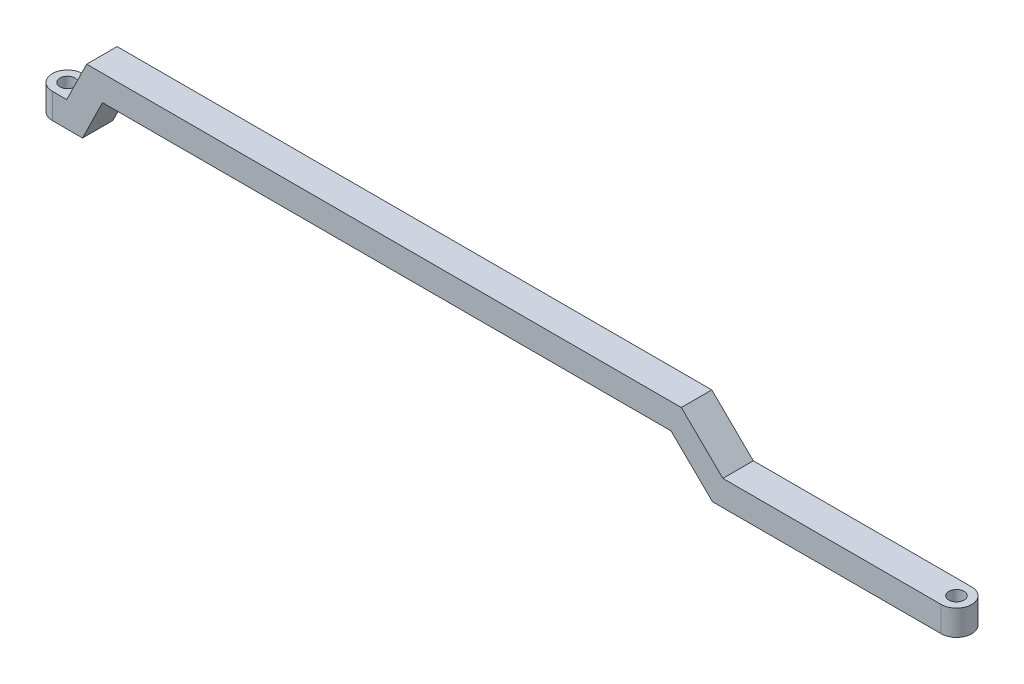
ISO-10303-21;
HEADER;
FILE_DESCRIPTION(('STEP AP214'),'2;1');
FILE_NAME('part.step','',(''),(''),'','','');
FILE_SCHEMA(('AUTOMOTIVE_DESIGN { 1 0 10303 214 1 1 1 1 }'));
ENDSEC;
DATA;
#1=APPLICATION_CONTEXT('core data for automotive mechanical design processes');
#2=APPLICATION_PROTOCOL_DEFINITION('international standard','automotive_design',2000,#1);
#3=PRODUCT_CONTEXT('',#1,'mechanical');
#4=PRODUCT('Part','Part','',(#3));
#5=PRODUCT_RELATED_PRODUCT_CATEGORY('part','',(#4));
#6=PRODUCT_DEFINITION_FORMATION('','',#4);
#7=PRODUCT_DEFINITION_CONTEXT('part definition',#1,'design');
#8=PRODUCT_DEFINITION('design','',#6,#7);
#9=PRODUCT_DEFINITION_SHAPE('','',#8);
#10=(LENGTH_UNIT() NAMED_UNIT(*) SI_UNIT(.MILLI.,.METRE.));
#11=(NAMED_UNIT(*) PLANE_ANGLE_UNIT() SI_UNIT($,.RADIAN.));
#12=(NAMED_UNIT(*) SI_UNIT($,.STERADIAN.) SOLID_ANGLE_UNIT());
#13=UNCERTAINTY_MEASURE_WITH_UNIT(LENGTH_MEASURE(1.E-05),#10,'distance_accuracy_value','');
#14=(GEOMETRIC_REPRESENTATION_CONTEXT(3) GLOBAL_UNCERTAINTY_ASSIGNED_CONTEXT((#13)) GLOBAL_UNIT_ASSIGNED_CONTEXT((#10,
#11,#12)) REPRESENTATION_CONTEXT('',''));
#15=CARTESIAN_POINT('',(0.,0.,0.));
#16=DIRECTION('',(0.,0.,1.));
#17=DIRECTION('',(1.,0.,0.));
#18=AXIS2_PLACEMENT_3D('',#15,#16,#17);
#19=CARTESIAN_POINT('',(175.,0.,0.));
#20=DIRECTION('',(0.,1.,0.));
#21=DIRECTION('',(0.,0.,1.));
#22=AXIS2_PLACEMENT_3D('',#19,#20,#21);
#23=PLANE('',#22);
#24=CARTESIAN_POINT('',(0.,0.,0.));
#25=DIRECTION('',(0.,1.,0.));
#26=DIRECTION('',(0.,0.,1.));
#27=AXIS2_PLACEMENT_3D('',#24,#25,#26);
#28=CIRCLE('',#27,1.5);
#29=CARTESIAN_POINT('',(0.,0.,1.5));
#30=VERTEX_POINT('',#29);
#31=EDGE_CURVE('E179',#30,#30,#28,.T.);
#32=ORIENTED_EDGE('',*,*,#31,.T.);
#33=EDGE_LOOP('',(#32));
#34=FACE_BOUND('',#33,.T.);
#35=DIRECTION('',(-1.,0.,0.));
#36=VECTOR('',#35,1.);
#37=CARTESIAN_POINT('',(175.,0.,-2.99999999999999));
#38=LINE('',#37,#36);
#39=CARTESIAN_POINT('',(5.95704390429327,0.,-3.));
#40=VERTEX_POINT('',#39);
#41=CARTESIAN_POINT('',(0.,0.,-3.));
#42=VERTEX_POINT('',#41);
#43=EDGE_CURVE('E205',#40,#42,#38,.T.);
#44=ORIENTED_EDGE('',*,*,#43,.F.);
#45=DIRECTION('',(0.,0.,1.));
#46=VECTOR('',#45,1.);
#47=CARTESIAN_POINT('',(5.95704390429327,0.,0.));
#48=LINE('',#47,#46);
#49=CARTESIAN_POINT('',(5.95704390429328,0.,3.));
#50=VERTEX_POINT('',#49);
#51=EDGE_CURVE('E149',#40,#50,#48,.T.);
#52=ORIENTED_EDGE('',*,*,#51,.T.);
#53=DIRECTION('',(1.,0.,0.));
#54=VECTOR('',#53,1.);
#55=CARTESIAN_POINT('',(0.,0.,3.));
#56=LINE('',#55,#54);
#57=CARTESIAN_POINT('',(0.,0.,3.));
#58=VERTEX_POINT('',#57);
#59=EDGE_CURVE('E192',#58,#50,#56,.T.);
#60=ORIENTED_EDGE('',*,*,#59,.F.);
#61=CARTESIAN_POINT('',(0.,0.,0.));
#62=DIRECTION('',(0.,1.,0.));
#63=DIRECTION('',(0.,0.,1.));
#64=AXIS2_PLACEMENT_3D('',#61,#62,#63);
#65=CIRCLE('',#64,3.);
#66=EDGE_CURVE('E207',#42,#58,#65,.T.);
#67=ORIENTED_EDGE('',*,*,#66,.F.);
#68=EDGE_LOOP('',(#44,#52,#60,#67));
#69=FACE_BOUND('',#68,.T.);
#70=ADVANCED_FACE('F34',(#34,#69),#23,.F.);
#71=CARTESIAN_POINT('',(175.,5.,0.));
#72=DIRECTION('',(0.,1.,0.));
#73=DIRECTION('',(0.,0.,1.));
#74=AXIS2_PLACEMENT_3D('',#71,#72,#73);
#75=PLANE('',#74);
#76=CARTESIAN_POINT('',(0.,5.,0.));
#77=DIRECTION('',(0.,1.,0.));
#78=DIRECTION('',(0.,0.,1.));
#79=AXIS2_PLACEMENT_3D('',#76,#77,#78);
#80=CIRCLE('',#79,1.5);
#81=CARTESIAN_POINT('',(0.,5.,1.5));
#82=VERTEX_POINT('',#81);
#83=EDGE_CURVE('E182',#82,#82,#80,.T.);
#84=ORIENTED_EDGE('',*,*,#83,.F.);
#85=EDGE_LOOP('',(#84));
#86=FACE_BOUND('',#85,.T.);
#87=DIRECTION('',(1.,0.,0.));
#88=VECTOR('',#87,1.);
#89=CARTESIAN_POINT('',(0.,5.,3.));
#90=LINE('',#89,#88);
#91=CARTESIAN_POINT('',(0.,5.,3.));
#92=VERTEX_POINT('',#91);
#93=CARTESIAN_POINT('',(2.84064601719081,5.,3.));
#94=VERTEX_POINT('',#93);
#95=EDGE_CURVE('E199',#92,#94,#90,.T.);
#96=ORIENTED_EDGE('',*,*,#95,.T.);
#97=DIRECTION('',(0.,0.,-1.));
#98=VECTOR('',#97,1.);
#99=CARTESIAN_POINT('',(2.84064601719081,5.,3.));
#100=LINE('',#99,#98);
#101=CARTESIAN_POINT('',(2.84064601719081,5.,-3.));
#102=VERTEX_POINT('',#101);
#103=EDGE_CURVE('E161',#94,#102,#100,.T.);
#104=ORIENTED_EDGE('',*,*,#103,.T.);
#105=DIRECTION('',(-1.,0.,0.));
#106=VECTOR('',#105,1.);
#107=CARTESIAN_POINT('',(175.,5.,-2.99999999999999));
#108=LINE('',#107,#106);
#109=CARTESIAN_POINT('',(0.,5.,-3.));
#110=VERTEX_POINT('',#109);
#111=EDGE_CURVE('E191',#102,#110,#108,.T.);
#112=ORIENTED_EDGE('',*,*,#111,.T.);
#113=CARTESIAN_POINT('',(0.,5.,0.));
#114=DIRECTION('',(0.,1.,0.));
#115=DIRECTION('',(0.,0.,1.));
#116=AXIS2_PLACEMENT_3D('',#113,#114,#115);
#117=CIRCLE('',#116,3.);
#118=EDGE_CURVE('E196',#110,#92,#117,.T.);
#119=ORIENTED_EDGE('',*,*,#118,.T.);
#120=EDGE_LOOP('',(#96,#104,#112,#119));
#121=FACE_BOUND('',#120,.T.);
#122=ADVANCED_FACE('F240',(#86,#121),#75,.T.);
#123=DIRECTION('',(0.,0.,-1.));
#124=VECTOR('',#123,1.);
#125=CARTESIAN_POINT('',(132.006982503277,5.,3.));
#126=LINE('',#125,#124);
#127=CARTESIAN_POINT('',(132.006982503277,5.,3.));
#128=VERTEX_POINT('',#127);
#129=CARTESIAN_POINT('',(132.006982503277,5.,-3.));
#130=VERTEX_POINT('',#129);
#131=EDGE_CURVE('E168',#128,#130,#126,.T.);
#132=ORIENTED_EDGE('',*,*,#131,.F.);
#133=CARTESIAN_POINT('',(175.,5.,2.99999999999999));
#134=VERTEX_POINT('',#133);
#135=EDGE_CURVE('E198',#128,#134,#90,.T.);
#136=ORIENTED_EDGE('',*,*,#135,.T.);
#137=CARTESIAN_POINT('',(175.,5.,0.));
#138=DIRECTION('',(0.,1.,0.));
#139=DIRECTION('',(0.,0.,1.));
#140=AXIS2_PLACEMENT_3D('',#137,#138,#139);
#141=CIRCLE('',#140,2.99999999999999);
#142=CARTESIAN_POINT('',(175.,5.,-2.99999999999999));
#143=VERTEX_POINT('',#142);
#144=EDGE_CURVE('E188',#134,#143,#141,.T.);
#145=ORIENTED_EDGE('',*,*,#144,.T.);
#146=EDGE_CURVE('E193',#143,#130,#108,.T.);
#147=ORIENTED_EDGE('',*,*,#146,.T.);
#148=EDGE_LOOP('',(#132,#136,#145,#147));
#149=FACE_BOUND('',#148,.T.);
#150=CARTESIAN_POINT('',(175.,5.,0.));
#151=DIRECTION('',(0.,1.,0.));
#152=DIRECTION('',(0.,0.,1.));
#153=AXIS2_PLACEMENT_3D('',#150,#151,#152);
#154=CIRCLE('',#153,1.5);
#155=CARTESIAN_POINT('',(175.,5.,1.5));
#156=VERTEX_POINT('',#155);
#157=EDGE_CURVE('E176',#156,#156,#154,.T.);
#158=ORIENTED_EDGE('',*,*,#157,.F.);
#159=EDGE_LOOP('',(#158));
#160=FACE_BOUND('',#159,.T.);
#161=ADVANCED_FACE('F251',(#149,#160),#75,.T.);
#162=CARTESIAN_POINT('',(129.967789522726,0.,3.));
#163=VERTEX_POINT('',#162);
#164=CARTESIAN_POINT('',(175.,0.,2.99999999999999));
#165=VERTEX_POINT('',#164);
#166=EDGE_CURVE('E209',#163,#165,#56,.T.);
#167=ORIENTED_EDGE('',*,*,#166,.F.);
#168=DIRECTION('',(0.,0.,-1.));
#169=VECTOR('',#168,1.);
#170=CARTESIAN_POINT('',(129.967789522726,0.,0.));
#171=LINE('',#170,#169);
#172=CARTESIAN_POINT('',(129.967789522726,0.,-3.));
#173=VERTEX_POINT('',#172);
#174=EDGE_CURVE('E49',#163,#173,#171,.T.);
#175=ORIENTED_EDGE('',*,*,#174,.T.);
#176=CARTESIAN_POINT('',(175.,0.,-2.99999999999999));
#177=VERTEX_POINT('',#176);
#178=EDGE_CURVE('E143',#177,#173,#38,.T.);
#179=ORIENTED_EDGE('',*,*,#178,.F.);
#180=CARTESIAN_POINT('',(175.,0.,0.));
#181=DIRECTION('',(0.,1.,0.));
#182=DIRECTION('',(0.,0.,1.));
#183=AXIS2_PLACEMENT_3D('',#180,#181,#182);
#184=CIRCLE('',#183,2.99999999999999);
#185=EDGE_CURVE('E185',#165,#177,#184,.T.);
#186=ORIENTED_EDGE('',*,*,#185,.F.);
#187=EDGE_LOOP('',(#167,#175,#179,#186));
#188=FACE_BOUND('',#187,.T.);
#189=CARTESIAN_POINT('',(175.,0.,0.));
#190=DIRECTION('',(0.,1.,0.));
#191=DIRECTION('',(0.,0.,1.));
#192=AXIS2_PLACEMENT_3D('',#189,#190,#191);
#193=CIRCLE('',#192,1.5);
#194=CARTESIAN_POINT('',(175.,0.,1.5));
#195=VERTEX_POINT('',#194);
#196=EDGE_CURVE('E170',#195,#195,#193,.T.);
#197=ORIENTED_EDGE('',*,*,#196,.T.);
#198=EDGE_LOOP('',(#197));
#199=FACE_BOUND('',#198,.T.);
#200=ADVANCED_FACE('F259',(#188,#199),#23,.F.);
#201=CARTESIAN_POINT('',(175.,5.,0.));
#202=DIRECTION('',(0.,-1.,0.));
#203=DIRECTION('',(0.,0.,-1.));
#204=AXIS2_PLACEMENT_3D('',#201,#202,#203);
#205=CYLINDRICAL_SURFACE('',#204,2.99999999999999);
#206=ORIENTED_EDGE('',*,*,#185,.T.);
#207=DIRECTION('',(0.,-1.,0.));
#208=VECTOR('',#207,1.);
#209=CARTESIAN_POINT('',(175.,5.,-2.99999999999999));
#210=LINE('',#209,#208);
#211=EDGE_CURVE('E220',#143,#177,#210,.T.);
#212=ORIENTED_EDGE('',*,*,#211,.F.);
#213=ORIENTED_EDGE('',*,*,#144,.F.);
#214=DIRECTION('',(0.,-1.,0.));
#215=VECTOR('',#214,1.);
#216=CARTESIAN_POINT('',(175.,5.,2.99999999999999));
#217=LINE('',#216,#215);
#218=EDGE_CURVE('E202',#134,#165,#217,.T.);
#219=ORIENTED_EDGE('',*,*,#218,.T.);
#220=EDGE_LOOP('',(#206,#212,#213,#219));
#221=FACE_BOUND('',#220,.T.);
#222=ADVANCED_FACE('F36',(#221),#205,.T.);
#223=CARTESIAN_POINT('',(175.,5.,-2.99999999999999));
#224=DIRECTION('',(0.,0.,1.));
#225=DIRECTION('',(1.,0.,0.));
#226=AXIS2_PLACEMENT_3D('',#223,#224,#225);
#227=PLANE('',#226);
#228=DIRECTION('',(1.,0.,0.));
#229=VECTOR('',#228,1.);
#230=CARTESIAN_POINT('',(9.88159134992837,8.,-3.));
#231=LINE('',#230,#229);
#232=CARTESIAN_POINT('',(9.88159134992837,8.,-3.));
#233=VERTEX_POINT('',#232);
#234=CARTESIAN_POINT('',(121.791342394145,7.99999999999999,-3.));
#235=VERTEX_POINT('',#234);
#236=EDGE_CURVE('E133',#233,#235,#231,.T.);
#237=ORIENTED_EDGE('',*,*,#236,.F.);
#238=DIRECTION('',(0.440426725303606,0.897788560652419,0.));
#239=VECTOR('',#238,1.);
#240=CARTESIAN_POINT('',(9.88159134992837,8.,-3.));
#241=LINE('',#240,#239);
#242=EDGE_CURVE('E130',#40,#233,#241,.T.);
#243=ORIENTED_EDGE('',*,*,#242,.F.);
#244=ORIENTED_EDGE('',*,*,#43,.T.);
#245=DIRECTION('',(0.,-1.,0.));
#246=VECTOR('',#245,1.);
#247=CARTESIAN_POINT('',(0.,5.,-3.));
#248=LINE('',#247,#246);
#249=EDGE_CURVE('E217',#110,#42,#248,.T.);
#250=ORIENTED_EDGE('',*,*,#249,.F.);
#251=ORIENTED_EDGE('',*,*,#111,.F.);
#252=DIRECTION('',(0.440426725303606,0.897788560652419,0.));
#253=VECTOR('',#252,1.);
#254=CARTESIAN_POINT('',(6.76519346282589,13.,-3.));
#255=LINE('',#254,#253);
#256=CARTESIAN_POINT('',(6.76519346282589,13.,-3.));
#257=VERTEX_POINT('',#256);
#258=EDGE_CURVE('E57',#102,#257,#255,.T.);
#259=ORIENTED_EDGE('',*,*,#258,.T.);
#260=DIRECTION('',(1.,0.,0.));
#261=VECTOR('',#260,1.);
#262=CARTESIAN_POINT('',(123.830535374697,13.,-3.));
#263=LINE('',#262,#261);
#264=CARTESIAN_POINT('',(123.830535374697,13.,-3.));
#265=VERTEX_POINT('',#264);
#266=EDGE_CURVE('E163',#257,#265,#263,.T.);
#267=ORIENTED_EDGE('',*,*,#266,.T.);
#268=DIRECTION('',(0.714777139316145,-0.699352301140869,0.));
#269=VECTOR('',#268,1.);
#270=CARTESIAN_POINT('',(132.006982503277,5.,-3.));
#271=LINE('',#270,#269);
#272=EDGE_CURVE('E156',#265,#130,#271,.T.);
#273=ORIENTED_EDGE('',*,*,#272,.T.);
#274=ORIENTED_EDGE('',*,*,#146,.F.);
#275=ORIENTED_EDGE('',*,*,#211,.T.);
#276=ORIENTED_EDGE('',*,*,#178,.T.);
#277=DIRECTION('',(0.714777139316145,-0.699352301140869,0.));
#278=VECTOR('',#277,1.);
#279=CARTESIAN_POINT('',(121.791342394145,7.99999999999999,-3.));
#280=LINE('',#279,#278);
#281=EDGE_CURVE('E125',#235,#173,#280,.T.);
#282=ORIENTED_EDGE('',*,*,#281,.F.);
#283=EDGE_LOOP('',(#237,#243,#244,#250,#251,#259,#267,#273,#274,#275,#276,#282));
#284=FACE_BOUND('',#283,.T.);
#285=ADVANCED_FACE('F141',(#284),#227,.F.);
#286=CARTESIAN_POINT('',(0.,5.,0.));
#287=DIRECTION('',(0.,-1.,0.));
#288=DIRECTION('',(0.,0.,-1.));
#289=AXIS2_PLACEMENT_3D('',#286,#287,#288);
#290=CYLINDRICAL_SURFACE('',#289,3.);
#291=ORIENTED_EDGE('',*,*,#66,.T.);
#292=DIRECTION('',(0.,-1.,0.));
#293=VECTOR('',#292,1.);
#294=CARTESIAN_POINT('',(0.,5.,3.));
#295=LINE('',#294,#293);
#296=EDGE_CURVE('E214',#92,#58,#295,.T.);
#297=ORIENTED_EDGE('',*,*,#296,.F.);
#298=ORIENTED_EDGE('',*,*,#118,.F.);
#299=ORIENTED_EDGE('',*,*,#249,.T.);
#300=EDGE_LOOP('',(#291,#297,#298,#299));
#301=FACE_BOUND('',#300,.T.);
#302=ADVANCED_FACE('F234',(#301),#290,.T.);
#303=CARTESIAN_POINT('',(0.,5.,3.));
#304=DIRECTION('',(0.,0.,-1.));
#305=DIRECTION('',(-1.,0.,0.));
#306=AXIS2_PLACEMENT_3D('',#303,#304,#305);
#307=PLANE('',#306);
#308=ORIENTED_EDGE('',*,*,#59,.T.);
#309=DIRECTION('',(0.440426725303606,0.897788560652419,0.));
#310=VECTOR('',#309,1.);
#311=CARTESIAN_POINT('',(6.77857251978876,1.67464631655135,3.));
#312=LINE('',#311,#310);
#313=CARTESIAN_POINT('',(9.88159134992837,8.,3.));
#314=VERTEX_POINT('',#313);
#315=EDGE_CURVE('E11',#50,#314,#312,.T.);
#316=ORIENTED_EDGE('',*,*,#315,.T.);
#317=DIRECTION('',(1.,0.,0.));
#318=VECTOR('',#317,1.);
#319=CARTESIAN_POINT('',(0.,8.,3.));
#320=LINE('',#319,#318);
#321=CARTESIAN_POINT('',(121.791342394145,7.99999999999999,3.));
#322=VERTEX_POINT('',#321);
#323=EDGE_CURVE('E42',#314,#322,#320,.T.);
#324=ORIENTED_EDGE('',*,*,#323,.T.);
#325=DIRECTION('',(0.714777139316145,-0.699352301140869,0.));
#326=VECTOR('',#325,1.);
#327=CARTESIAN_POINT('',(61.0670142189035,67.4139016326394,3.));
#328=LINE('',#327,#326);
#329=EDGE_CURVE('E126',#322,#163,#328,.T.);
#330=ORIENTED_EDGE('',*,*,#329,.T.);
#331=ORIENTED_EDGE('',*,*,#166,.T.);
#332=ORIENTED_EDGE('',*,*,#218,.F.);
#333=ORIENTED_EDGE('',*,*,#135,.F.);
#334=DIRECTION('',(0.714777139316145,-0.699352301140869,0.));
#335=VECTOR('',#334,1.);
#336=CARTESIAN_POINT('',(132.006982503277,5.,3.));
#337=LINE('',#336,#335);
#338=CARTESIAN_POINT('',(123.830535374697,13.,3.));
#339=VERTEX_POINT('',#338);
#340=EDGE_CURVE('E159',#339,#128,#337,.T.);
#341=ORIENTED_EDGE('',*,*,#340,.F.);
#342=DIRECTION('',(1.,0.,0.));
#343=VECTOR('',#342,1.);
#344=CARTESIAN_POINT('',(123.830535374697,13.,3.));
#345=LINE('',#344,#343);
#346=CARTESIAN_POINT('',(6.76519346282589,13.,3.));
#347=VERTEX_POINT('',#346);
#348=EDGE_CURVE('E155',#347,#339,#345,.T.);
#349=ORIENTED_EDGE('',*,*,#348,.F.);
#350=DIRECTION('',(0.440426725303606,0.897788560652419,0.));
#351=VECTOR('',#350,1.);
#352=CARTESIAN_POINT('',(6.76519346282589,13.,3.));
#353=LINE('',#352,#351);
#354=EDGE_CURVE('E152',#94,#347,#353,.T.);
#355=ORIENTED_EDGE('',*,*,#354,.F.);
#356=ORIENTED_EDGE('',*,*,#95,.F.);
#357=ORIENTED_EDGE('',*,*,#296,.T.);
#358=EDGE_LOOP('',(#308,#316,#324,#330,#331,#332,#333,#341,#349,#355,#356,#357));
#359=FACE_BOUND('',#358,.T.);
#360=ADVANCED_FACE('F223',(#359),#307,.F.);
#361=CARTESIAN_POINT('',(0.,5.,0.));
#362=DIRECTION('',(0.,-1.,0.));
#363=DIRECTION('',(0.,0.,-1.));
#364=AXIS2_PLACEMENT_3D('',#361,#362,#363);
#365=CYLINDRICAL_SURFACE('',#364,1.5);
#366=ORIENTED_EDGE('',*,*,#83,.T.);
#367=EDGE_LOOP('',(#366));
#368=FACE_BOUND('',#367,.T.);
#369=ORIENTED_EDGE('',*,*,#31,.F.);
#370=EDGE_LOOP('',(#369));
#371=FACE_BOUND('',#370,.T.);
#372=ADVANCED_FACE('F267',(#368,#371),#365,.F.);
#373=CARTESIAN_POINT('',(175.,5.,0.));
#374=DIRECTION('',(0.,-1.,0.));
#375=DIRECTION('',(0.,0.,-1.));
#376=AXIS2_PLACEMENT_3D('',#373,#374,#375);
#377=CYLINDRICAL_SURFACE('',#376,1.5);
#378=ORIENTED_EDGE('',*,*,#157,.T.);
#379=EDGE_LOOP('',(#378));
#380=FACE_BOUND('',#379,.T.);
#381=ORIENTED_EDGE('',*,*,#196,.F.);
#382=EDGE_LOOP('',(#381));
#383=FACE_BOUND('',#382,.T.);
#384=ADVANCED_FACE('F265',(#380,#383),#377,.F.);
#385=CARTESIAN_POINT('',(132.006982503277,5.,3.));
#386=DIRECTION('',(0.699352301140869,0.714777139316145,0.));
#387=DIRECTION('',(-0.714777139316145,0.699352301140869,0.));
#388=AXIS2_PLACEMENT_3D('',#385,#386,#387);
#389=PLANE('',#388);
#390=ORIENTED_EDGE('',*,*,#272,.F.);
#391=DIRECTION('',(0.,0.,-1.));
#392=VECTOR('',#391,1.);
#393=CARTESIAN_POINT('',(123.830535374697,13.,3.));
#394=LINE('',#393,#392);
#395=EDGE_CURVE('E171',#339,#265,#394,.T.);
#396=ORIENTED_EDGE('',*,*,#395,.F.);
#397=ORIENTED_EDGE('',*,*,#340,.T.);
#398=ORIENTED_EDGE('',*,*,#131,.T.);
#399=EDGE_LOOP('',(#390,#396,#397,#398));
#400=FACE_BOUND('',#399,.T.);
#401=ADVANCED_FACE('F246',(#400),#389,.T.);
#402=CARTESIAN_POINT('',(123.830535374697,13.,3.));
#403=DIRECTION('',(0.,1.,0.));
#404=DIRECTION('',(0.,0.,1.));
#405=AXIS2_PLACEMENT_3D('',#402,#403,#404);
#406=PLANE('',#405);
#407=ORIENTED_EDGE('',*,*,#266,.F.);
#408=DIRECTION('',(0.,0.,-1.));
#409=VECTOR('',#408,1.);
#410=CARTESIAN_POINT('',(6.76519346282589,13.,3.));
#411=LINE('',#410,#409);
#412=EDGE_CURVE('E173',#347,#257,#411,.T.);
#413=ORIENTED_EDGE('',*,*,#412,.F.);
#414=ORIENTED_EDGE('',*,*,#348,.T.);
#415=ORIENTED_EDGE('',*,*,#395,.T.);
#416=EDGE_LOOP('',(#407,#413,#414,#415));
#417=FACE_BOUND('',#416,.T.);
#418=ADVANCED_FACE('F274',(#417),#406,.T.);
#419=CARTESIAN_POINT('',(6.76519346282589,13.,3.));
#420=DIRECTION('',(-0.897788560652419,0.440426725303606,0.));
#421=DIRECTION('',(-0.440426725303606,-0.897788560652419,0.));
#422=AXIS2_PLACEMENT_3D('',#419,#420,#421);
#423=PLANE('',#422);
#424=ORIENTED_EDGE('',*,*,#258,.F.);
#425=ORIENTED_EDGE('',*,*,#103,.F.);
#426=ORIENTED_EDGE('',*,*,#354,.T.);
#427=ORIENTED_EDGE('',*,*,#412,.T.);
#428=EDGE_LOOP('',(#424,#425,#426,#427));
#429=FACE_BOUND('',#428,.T.);
#430=ADVANCED_FACE('F346',(#429),#423,.T.);
#431=CARTESIAN_POINT('',(9.88159134992837,8.,19.));
#432=DIRECTION('',(0.,1.,0.));
#433=DIRECTION('',(-1.,0.,0.));
#434=AXIS2_PLACEMENT_3D('',#431,#432,#433);
#435=PLANE('',#434);
#436=DIRECTION('',(0.,0.,-1.));
#437=VECTOR('',#436,1.);
#438=CARTESIAN_POINT('',(9.88159134992837,8.,19.));
#439=LINE('',#438,#437);
#440=EDGE_CURVE('E129',#314,#233,#439,.T.);
#441=ORIENTED_EDGE('',*,*,#440,.T.);
#442=ORIENTED_EDGE('',*,*,#236,.T.);
#443=DIRECTION('',(0.,0.,-1.));
#444=VECTOR('',#443,1.);
#445=CARTESIAN_POINT('',(121.791342394145,7.99999999999999,19.));
#446=LINE('',#445,#444);
#447=EDGE_CURVE('E121',#322,#235,#446,.T.);
#448=ORIENTED_EDGE('',*,*,#447,.F.);
#449=ORIENTED_EDGE('',*,*,#323,.F.);
#450=EDGE_LOOP('',(#441,#442,#448,#449));
#451=FACE_BOUND('',#450,.T.);
#452=ADVANCED_FACE('F134',(#451),#435,.F.);
#453=CARTESIAN_POINT('',(9.88159134992837,8.,19.));
#454=DIRECTION('',(-0.897788560652419,0.440426725303606,0.));
#455=DIRECTION('',(-0.440426725303606,-0.897788560652419,0.));
#456=AXIS2_PLACEMENT_3D('',#453,#454,#455);
#457=PLANE('',#456);
#458=ORIENTED_EDGE('',*,*,#242,.T.);
#459=ORIENTED_EDGE('',*,*,#440,.F.);
#460=ORIENTED_EDGE('',*,*,#315,.F.);
#461=ORIENTED_EDGE('',*,*,#51,.F.);
#462=EDGE_LOOP('',(#458,#459,#460,#461));
#463=FACE_BOUND('',#462,.T.);
#464=ADVANCED_FACE('F226',(#463),#457,.F.);
#465=CARTESIAN_POINT('',(121.791342394145,7.99999999999999,19.));
#466=DIRECTION('',(0.699352301140869,0.714777139316145,0.));
#467=DIRECTION('',(-0.714777139316145,0.699352301140869,0.));
#468=AXIS2_PLACEMENT_3D('',#465,#466,#467);
#469=PLANE('',#468);
#470=ORIENTED_EDGE('',*,*,#329,.F.);
#471=ORIENTED_EDGE('',*,*,#447,.T.);
#472=ORIENTED_EDGE('',*,*,#281,.T.);
#473=ORIENTED_EDGE('',*,*,#174,.F.);
#474=EDGE_LOOP('',(#470,#471,#472,#473));
#475=FACE_BOUND('',#474,.T.);
#476=ADVANCED_FACE('F123',(#475),#469,.F.);
#477=CLOSED_SHELL('',(#70,#122,#161,#200,#222,#285,#302,#360,#372,#384,#401,#418,#430,#452,#464,#476));
#478=MANIFOLD_SOLID_BREP('B2',#477);
#479=ADVANCED_BREP_SHAPE_REPRESENTATION('',(#18,#478),#14);
#480=SHAPE_DEFINITION_REPRESENTATION(#9,#479);
ENDSEC;
END-ISO-10303-21;
